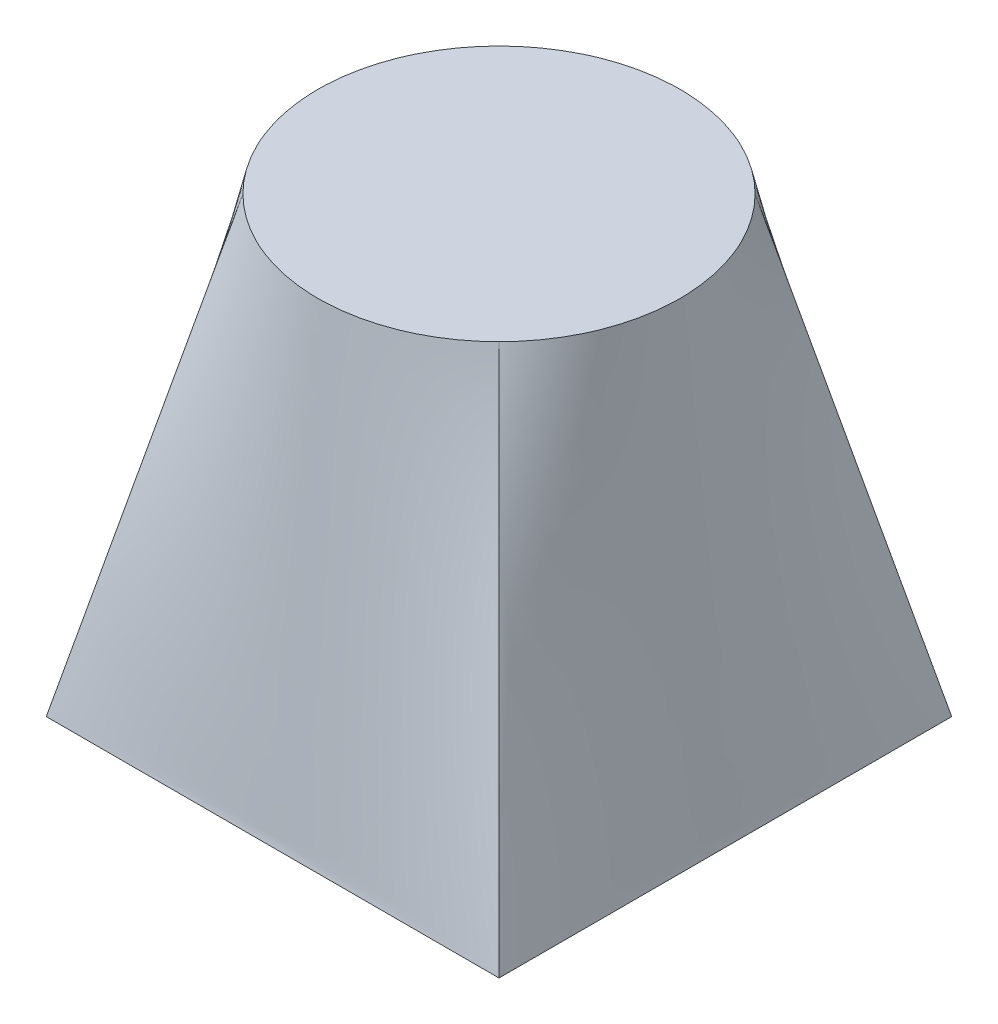
ISO-10303-21;
HEADER;
FILE_DESCRIPTION(('STEP AP214'),'2;1');
FILE_NAME('part.step','',(''),(''),'','','');
FILE_SCHEMA(('AUTOMOTIVE_DESIGN { 1 0 10303 214 1 1 1 1 }'));
ENDSEC;
DATA;
#1=APPLICATION_CONTEXT('core data for automotive mechanical design processes');
#2=APPLICATION_PROTOCOL_DEFINITION('international standard','automotive_design',2000,#1);
#3=PRODUCT_CONTEXT('',#1,'mechanical');
#4=PRODUCT('Part','Part','',(#3));
#5=PRODUCT_RELATED_PRODUCT_CATEGORY('part','',(#4));
#6=PRODUCT_DEFINITION_FORMATION('','',#4);
#7=PRODUCT_DEFINITION_CONTEXT('part definition',#1,'design');
#8=PRODUCT_DEFINITION('design','',#6,#7);
#9=PRODUCT_DEFINITION_SHAPE('','',#8);
#10=(LENGTH_UNIT() NAMED_UNIT(*) SI_UNIT(.MILLI.,.METRE.));
#11=(NAMED_UNIT(*) PLANE_ANGLE_UNIT() SI_UNIT($,.RADIAN.));
#12=(NAMED_UNIT(*) SI_UNIT($,.STERADIAN.) SOLID_ANGLE_UNIT());
#13=UNCERTAINTY_MEASURE_WITH_UNIT(LENGTH_MEASURE(1.E-05),#10,'distance_accuracy_value','');
#14=(GEOMETRIC_REPRESENTATION_CONTEXT(3) GLOBAL_UNCERTAINTY_ASSIGNED_CONTEXT((#13)) GLOBAL_UNIT_ASSIGNED_CONTEXT((#10,
#11,#12)) REPRESENTATION_CONTEXT('',''));
#15=CARTESIAN_POINT('',(0.,0.,0.));
#16=DIRECTION('',(0.,0.,1.));
#17=DIRECTION('',(1.,0.,0.));
#18=AXIS2_PLACEMENT_3D('',#15,#16,#17);
#19=CARTESIAN_POINT('',(0.,10.,0.));
#20=DIRECTION('',(0.,1.,0.));
#21=DIRECTION('',(0.,0.,1.));
#22=AXIS2_PLACEMENT_3D('',#19,#20,#21);
#23=PLANE('',#22);
#24=CARTESIAN_POINT('',(0.,10.,0.));
#25=DIRECTION('',(0.,1.,0.));
#26=DIRECTION('',(0.,0.,1.));
#27=AXIS2_PLACEMENT_3D('',#24,#25,#26);
#28=CIRCLE('',#27,4.);
#29=CARTESIAN_POINT('',(2.82842712474619,10.,2.82842712474619));
#30=VERTEX_POINT('',#29);
#31=CARTESIAN_POINT('',(2.82842712474619,10.,-2.82842712474619));
#32=VERTEX_POINT('',#31);
#33=EDGE_CURVE('E12',#30,#32,#28,.T.);
#34=ORIENTED_EDGE('',*,*,#33,.T.);
#35=CARTESIAN_POINT('',(-2.82842712474619,10.,-2.82842712474619));
#36=VERTEX_POINT('',#35);
#37=EDGE_CURVE('E75',#32,#36,#28,.T.);
#38=ORIENTED_EDGE('',*,*,#37,.T.);
#39=CARTESIAN_POINT('',(-2.82842712474619,10.,2.82842712474619));
#40=VERTEX_POINT('',#39);
#41=EDGE_CURVE('E138',#36,#40,#28,.T.);
#42=ORIENTED_EDGE('',*,*,#41,.T.);
#43=EDGE_CURVE('E198',#40,#30,#28,.T.);
#44=ORIENTED_EDGE('',*,*,#43,.T.);
#45=EDGE_LOOP('',(#34,#38,#42,#44));
#46=FACE_BOUND('',#45,.T.);
#47=ADVANCED_FACE('F65',(#46),#23,.T.);
#48=CARTESIAN_POINT('',(0.,0.,0.));
#49=DIRECTION('',(0.,-1.,0.));
#50=DIRECTION('',(0.,0.,-1.));
#51=AXIS2_PLACEMENT_3D('',#48,#49,#50);
#52=PLANE('',#51);
#53=DIRECTION('',(0.,0.,-1.));
#54=VECTOR('',#53,1.);
#55=CARTESIAN_POINT('',(5.,0.,5.));
#56=LINE('',#55,#54);
#57=CARTESIAN_POINT('',(5.,0.,5.));
#58=VERTEX_POINT('',#57);
#59=CARTESIAN_POINT('',(5.,0.,-5.));
#60=VERTEX_POINT('',#59);
#61=EDGE_CURVE('E133',#58,#60,#56,.T.);
#62=ORIENTED_EDGE('',*,*,#61,.F.);
#63=DIRECTION('',(1.,0.,0.));
#64=VECTOR('',#63,1.);
#65=CARTESIAN_POINT('',(-5.,0.,5.));
#66=LINE('',#65,#64);
#67=CARTESIAN_POINT('',(-5.,0.,5.));
#68=VERTEX_POINT('',#67);
#69=EDGE_CURVE('E115',#68,#58,#66,.T.);
#70=ORIENTED_EDGE('',*,*,#69,.F.);
#71=DIRECTION('',(0.,0.,1.));
#72=VECTOR('',#71,1.);
#73=CARTESIAN_POINT('',(-5.,0.,5.));
#74=LINE('',#73,#72);
#75=CARTESIAN_POINT('',(-5.,0.,-5.));
#76=VERTEX_POINT('',#75);
#77=EDGE_CURVE('E106',#76,#68,#74,.T.);
#78=ORIENTED_EDGE('',*,*,#77,.F.);
#79=DIRECTION('',(-1.,0.,0.));
#80=VECTOR('',#79,1.);
#81=CARTESIAN_POINT('',(-5.,0.,-5.));
#82=LINE('',#81,#80);
#83=EDGE_CURVE('E111',#60,#76,#82,.T.);
#84=ORIENTED_EDGE('',*,*,#83,.F.);
#85=EDGE_LOOP('',(#62,#70,#78,#84));
#86=FACE_BOUND('',#85,.T.);
#87=ADVANCED_FACE('F110',(#86),#52,.T.);
#88=CARTESIAN_POINT('',(5.,0.,-5.));
#89=CARTESIAN_POINT('',(2.82842712474619,10.,-2.82842712474619));
#90=CARTESIAN_POINT('',(4.16666666666667,0.,-5.));
#91=CARTESIAN_POINT('',(2.49509379141286,10.,-3.16176045807952));
#92=CARTESIAN_POINT('',(3.33333333333334,0.,-5.));
#93=CARTESIAN_POINT('',(2.0747177697197,10.,-3.46063438484183));
#94=CARTESIAN_POINT('',(1.66666666666667,0.,-5.));
#95=CARTESIAN_POINT('',(1.10270101027287,10.,-3.88130063915222));
#96=CARTESIAN_POINT('',(0.833333333333337,0.,-5.));
#97=CARTESIAN_POINT('',(0.552284749830794,10.,-4.));
#98=CARTESIAN_POINT('',(-0.833333333333329,0.,-5.));
#99=CARTESIAN_POINT('',(-0.552284749830793,10.,-4.));
#100=CARTESIAN_POINT('',(-1.66666666666666,0.,-5.));
#101=CARTESIAN_POINT('',(-1.10270101027287,10.,-3.88130063915222));
#102=CARTESIAN_POINT('',(-3.33333333333333,0.,-5.));
#103=CARTESIAN_POINT('',(-2.0747177697197,10.,-3.46063438484183));
#104=CARTESIAN_POINT('',(-4.16666666666667,0.,-5.));
#105=CARTESIAN_POINT('',(-2.49509379141286,10.,-3.16176045807952));
#106=CARTESIAN_POINT('',(-5.,0.,-5.));
#107=CARTESIAN_POINT('',(-2.82842712474619,10.,-2.82842712474619));
#108=B_SPLINE_SURFACE_WITH_KNOTS('',3,1,((#88,#89),(#90,#91),(#92,#93),(#94,#95),(#96,#97),(#98,
#99),(#100,#101),(#102,#103),(#104,#105),(#106,#107)),.UNSPECIFIED.,.F.,.F.,.F.,(4,2,2,2,4),(2,
2),(0.,0.25,0.5,0.75,1.),(0.,1.),.UNSPECIFIED.);
#109=DIRECTION('',(0.207588512312193,0.955936200335577,0.207588512312193));
#110=VECTOR('',#109,1.);
#111=CARTESIAN_POINT('',(-3.91421356237309,5.,-3.9142135623731));
#112=LINE('',#111,#110);
#113=EDGE_CURVE('E130',#76,#36,#112,.T.);
#114=DIRECTION('',(0.207588512312193,-0.955936200335577,-0.207588512312193));
#115=VECTOR('',#114,1.);
#116=CARTESIAN_POINT('',(3.9142135623731,5.,-3.91421356237309));
#117=LINE('',#116,#115);
#118=EDGE_CURVE('E132',#32,#60,#117,.T.);
#119=ORIENTED_EDGE('',*,*,#83,.T.);
#120=ORIENTED_EDGE('',*,*,#113,.T.);
#121=ORIENTED_EDGE('',*,*,#37,.F.);
#122=ORIENTED_EDGE('',*,*,#118,.T.);
#123=EDGE_LOOP('',(#119,#120,#121,#122));
#124=FACE_BOUND('',#123,.T.);
#125=ADVANCED_FACE('F129',(#124),#108,.T.);
#126=CARTESIAN_POINT('',(-5.,0.,-5.));
#127=CARTESIAN_POINT('',(-2.82842712474619,10.,-2.82842712474619));
#128=CARTESIAN_POINT('',(-5.,0.,-4.16666666666667));
#129=CARTESIAN_POINT('',(-3.16176045807952,10.,-2.49509379141286));
#130=CARTESIAN_POINT('',(-5.,0.,-3.33333333333333));
#131=CARTESIAN_POINT('',(-3.46063438484183,10.,-2.0747177697197));
#132=CARTESIAN_POINT('',(-5.,0.,-1.66666666666667));
#133=CARTESIAN_POINT('',(-3.88130063915222,10.,-1.10270101027287));
#134=CARTESIAN_POINT('',(-5.,0.,-0.833333333333337));
#135=CARTESIAN_POINT('',(-4.,10.,-0.552284749830794));
#136=CARTESIAN_POINT('',(-5.,0.,0.833333333333329));
#137=CARTESIAN_POINT('',(-4.,10.,0.552284749830792));
#138=CARTESIAN_POINT('',(-5.,0.,1.66666666666666));
#139=CARTESIAN_POINT('',(-3.88130063915222,10.,1.10270101027287));
#140=CARTESIAN_POINT('',(-5.,0.,3.33333333333333));
#141=CARTESIAN_POINT('',(-3.46063438484183,10.,2.0747177697197));
#142=CARTESIAN_POINT('',(-5.,0.,4.16666666666667));
#143=CARTESIAN_POINT('',(-3.16176045807952,10.,2.49509379141286));
#144=CARTESIAN_POINT('',(-5.,0.,5.));
#145=CARTESIAN_POINT('',(-2.82842712474619,10.,2.82842712474619));
#146=B_SPLINE_SURFACE_WITH_KNOTS('',3,1,((#126,#127),(#128,#129),(#130,#131),(#132,#133),(#134,
#135),(#136,#137),(#138,#139),(#140,#141),(#142,#143),(#144,#145)),.UNSPECIFIED.,.F.,.F.,.F.,(4,
2,2,2,4),(2,2),(0.,0.25,0.5,0.75,1.),(0.,1.),.UNSPECIFIED.);
#147=DIRECTION('',(0.207588512312193,0.955936200335577,-0.207588512312193));
#148=VECTOR('',#147,1.);
#149=CARTESIAN_POINT('',(-3.9142135623731,5.,3.91421356237309));
#150=LINE('',#149,#148);
#151=EDGE_CURVE('E140',#68,#40,#150,.T.);
#152=ORIENTED_EDGE('',*,*,#77,.T.);
#153=ORIENTED_EDGE('',*,*,#151,.T.);
#154=ORIENTED_EDGE('',*,*,#41,.F.);
#155=ORIENTED_EDGE('',*,*,#113,.F.);
#156=EDGE_LOOP('',(#152,#153,#154,#155));
#157=FACE_BOUND('',#156,.T.);
#158=ADVANCED_FACE('F137',(#157),#146,.T.);
#159=CARTESIAN_POINT('',(5.,0.,5.));
#160=CARTESIAN_POINT('',(2.82842712474619,10.,2.82842712474619));
#161=CARTESIAN_POINT('',(5.,0.,4.16666666666667));
#162=CARTESIAN_POINT('',(3.16176045807953,10.,2.49509379141286));
#163=CARTESIAN_POINT('',(5.,0.,3.33333333333333));
#164=CARTESIAN_POINT('',(3.46063438484183,10.,2.0747177697197));
#165=CARTESIAN_POINT('',(5.,0.,1.66666666666667));
#166=CARTESIAN_POINT('',(3.88130063915222,10.,1.10270101027287));
#167=CARTESIAN_POINT('',(5.,0.,0.833333333333337));
#168=CARTESIAN_POINT('',(4.,9.99999999999999,0.552284749830794));
#169=CARTESIAN_POINT('',(5.,0.,-0.83333333333333));
#170=CARTESIAN_POINT('',(4.,10.,-0.552284749830793));
#171=CARTESIAN_POINT('',(5.,0.,-1.66666666666666));
#172=CARTESIAN_POINT('',(3.88130063915222,10.,-1.10270101027287));
#173=CARTESIAN_POINT('',(5.,0.,-3.33333333333333));
#174=CARTESIAN_POINT('',(3.46063438484183,10.,-2.0747177697197));
#175=CARTESIAN_POINT('',(5.,0.,-4.16666666666667));
#176=CARTESIAN_POINT('',(3.16176045807952,10.,-2.49509379141286));
#177=CARTESIAN_POINT('',(5.,0.,-5.));
#178=CARTESIAN_POINT('',(2.82842712474619,10.,-2.82842712474619));
#179=B_SPLINE_SURFACE_WITH_KNOTS('',3,1,((#159,#160),(#161,#162),(#163,#164),(#165,#166),(#167,
#168),(#169,#170),(#171,#172),(#173,#174),(#175,#176),(#177,#178)),.UNSPECIFIED.,.F.,.F.,.F.,(4,
2,2,2,4),(2,2),(0.,0.25,0.5,0.75,1.),(0.,1.),.UNSPECIFIED.);
#180=DIRECTION('',(-0.207588512312193,0.955936200335577,-0.207588512312193));
#181=VECTOR('',#180,1.);
#182=CARTESIAN_POINT('',(3.9142135623731,5.,3.9142135623731));
#183=LINE('',#182,#181);
#184=EDGE_CURVE('E142',#58,#30,#183,.T.);
#185=ORIENTED_EDGE('',*,*,#61,.T.);
#186=ORIENTED_EDGE('',*,*,#118,.F.);
#187=ORIENTED_EDGE('',*,*,#33,.F.);
#188=ORIENTED_EDGE('',*,*,#184,.F.);
#189=EDGE_LOOP('',(#185,#186,#187,#188));
#190=FACE_BOUND('',#189,.T.);
#191=ADVANCED_FACE('F167',(#190),#179,.T.);
#192=CARTESIAN_POINT('',(-5.,0.,5.));
#193=CARTESIAN_POINT('',(-2.82842712474619,10.,2.82842712474619));
#194=CARTESIAN_POINT('',(-4.16666666666667,0.,5.));
#195=CARTESIAN_POINT('',(-2.49509379141286,10.,3.16176045807952));
#196=CARTESIAN_POINT('',(-3.33333333333333,0.,5.));
#197=CARTESIAN_POINT('',(-2.0747177697197,10.,3.46063438484183));
#198=CARTESIAN_POINT('',(-1.66666666666667,0.,5.));
#199=CARTESIAN_POINT('',(-1.10270101027287,10.,3.88130063915222));
#200=CARTESIAN_POINT('',(-0.833333333333337,0.,5.));
#201=CARTESIAN_POINT('',(-0.552284749830794,9.99999999999999,4.));
#202=CARTESIAN_POINT('',(0.83333333333333,0.,5.));
#203=CARTESIAN_POINT('',(0.552284749830793,10.,4.));
#204=CARTESIAN_POINT('',(1.66666666666666,0.,5.));
#205=CARTESIAN_POINT('',(1.10270101027287,10.,3.88130063915222));
#206=CARTESIAN_POINT('',(3.33333333333333,0.,5.));
#207=CARTESIAN_POINT('',(2.0747177697197,10.,3.46063438484183));
#208=CARTESIAN_POINT('',(4.16666666666667,0.,5.));
#209=CARTESIAN_POINT('',(2.49509379141286,10.,3.16176045807952));
#210=CARTESIAN_POINT('',(5.,0.,5.));
#211=CARTESIAN_POINT('',(2.82842712474619,10.,2.82842712474619));
#212=B_SPLINE_SURFACE_WITH_KNOTS('',3,1,((#192,#193),(#194,#195),(#196,#197),(#198,#199),(#200,
#201),(#202,#203),(#204,#205),(#206,#207),(#208,#209),(#210,#211)),.UNSPECIFIED.,.F.,.F.,.F.,(4,
2,2,2,4),(2,2),(0.,0.25,0.5,0.75,1.),(0.,1.),.UNSPECIFIED.);
#213=ORIENTED_EDGE('',*,*,#69,.T.);
#214=ORIENTED_EDGE('',*,*,#184,.T.);
#215=ORIENTED_EDGE('',*,*,#43,.F.);
#216=ORIENTED_EDGE('',*,*,#151,.F.);
#217=EDGE_LOOP('',(#213,#214,#215,#216));
#218=FACE_BOUND('',#217,.T.);
#219=ADVANCED_FACE('F306',(#218),#212,.T.);
#220=CLOSED_SHELL('',(#47,#87,#125,#158,#191,#219));
#221=MANIFOLD_SOLID_BREP('B2',#220);
#222=ADVANCED_BREP_SHAPE_REPRESENTATION('',(#18,#221),#14);
#223=SHAPE_DEFINITION_REPRESENTATION(#9,#222);
ENDSEC;
END-ISO-10303-21;
